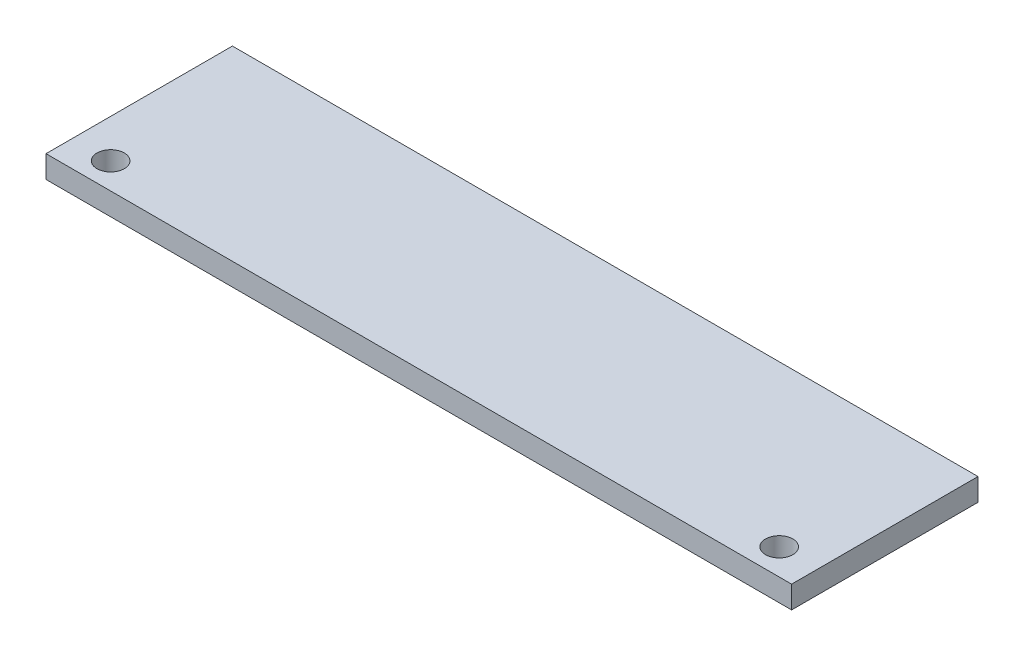
ISO-10303-21;
HEADER;
FILE_DESCRIPTION(('STEP AP214'),'2;1');
FILE_NAME('part.step','',(''),(''),'','','');
FILE_SCHEMA(('AUTOMOTIVE_DESIGN { 1 0 10303 214 1 1 1 1 }'));
ENDSEC;
DATA;
#1=APPLICATION_CONTEXT('core data for automotive mechanical design processes');
#2=APPLICATION_PROTOCOL_DEFINITION('international standard','automotive_design',2000,#1);
#3=PRODUCT_CONTEXT('',#1,'mechanical');
#4=PRODUCT('Part','Part','',(#3));
#5=PRODUCT_RELATED_PRODUCT_CATEGORY('part','',(#4));
#6=PRODUCT_DEFINITION_FORMATION('','',#4);
#7=PRODUCT_DEFINITION_CONTEXT('part definition',#1,'design');
#8=PRODUCT_DEFINITION('design','',#6,#7);
#9=PRODUCT_DEFINITION_SHAPE('','',#8);
#10=(LENGTH_UNIT() NAMED_UNIT(*) SI_UNIT(.MILLI.,.METRE.));
#11=(NAMED_UNIT(*) PLANE_ANGLE_UNIT() SI_UNIT($,.RADIAN.));
#12=(NAMED_UNIT(*) SI_UNIT($,.STERADIAN.) SOLID_ANGLE_UNIT());
#13=UNCERTAINTY_MEASURE_WITH_UNIT(LENGTH_MEASURE(1.E-05),#10,'distance_accuracy_value','');
#14=(GEOMETRIC_REPRESENTATION_CONTEXT(3) GLOBAL_UNCERTAINTY_ASSIGNED_CONTEXT((#13)) GLOBAL_UNIT_ASSIGNED_CONTEXT((#10,
#11,#12)) REPRESENTATION_CONTEXT('',''));
#15=CARTESIAN_POINT('',(0.,0.,0.));
#16=DIRECTION('',(0.,0.,1.));
#17=DIRECTION('',(1.,0.,0.));
#18=AXIS2_PLACEMENT_3D('',#15,#16,#17);
#19=CARTESIAN_POINT('',(300.,18.,-75.));
#20=DIRECTION('',(-1.,0.,0.));
#21=DIRECTION('',(0.,0.,1.));
#22=AXIS2_PLACEMENT_3D('',#19,#20,#21);
#23=PLANE('',#22);
#24=DIRECTION('',(0.,0.,-1.));
#25=VECTOR('',#24,1.);
#26=CARTESIAN_POINT('',(300.,0.,-75.));
#27=LINE('',#26,#25);
#28=CARTESIAN_POINT('',(300.,0.,75.));
#29=VERTEX_POINT('',#28);
#30=CARTESIAN_POINT('',(300.,0.,-75.));
#31=VERTEX_POINT('',#30);
#32=EDGE_CURVE('E105',#29,#31,#27,.T.);
#33=ORIENTED_EDGE('',*,*,#32,.T.);
#34=DIRECTION('',(0.,-1.,0.));
#35=VECTOR('',#34,1.);
#36=CARTESIAN_POINT('',(300.,18.,-75.));
#37=LINE('',#36,#35);
#38=CARTESIAN_POINT('',(300.,18.,-75.));
#39=VERTEX_POINT('',#38);
#40=EDGE_CURVE('E11',#39,#31,#37,.T.);
#41=ORIENTED_EDGE('',*,*,#40,.F.);
#42=DIRECTION('',(0.,0.,-1.));
#43=VECTOR('',#42,1.);
#44=CARTESIAN_POINT('',(300.,18.,-75.));
#45=LINE('',#44,#43);
#46=CARTESIAN_POINT('',(300.,18.,75.));
#47=VERTEX_POINT('',#46);
#48=EDGE_CURVE('E92',#47,#39,#45,.T.);
#49=ORIENTED_EDGE('',*,*,#48,.F.);
#50=DIRECTION('',(0.,-1.,0.));
#51=VECTOR('',#50,1.);
#52=CARTESIAN_POINT('',(300.,18.,75.));
#53=LINE('',#52,#51);
#54=EDGE_CURVE('E101',#47,#29,#53,.T.);
#55=ORIENTED_EDGE('',*,*,#54,.T.);
#56=EDGE_LOOP('',(#33,#41,#49,#55));
#57=FACE_BOUND('',#56,.T.);
#58=ADVANCED_FACE('F39',(#57),#23,.F.);
#59=CARTESIAN_POINT('',(-300.,18.,-75.));
#60=DIRECTION('',(0.,0.,1.));
#61=DIRECTION('',(1.,0.,0.));
#62=AXIS2_PLACEMENT_3D('',#59,#60,#61);
#63=PLANE('',#62);
#64=DIRECTION('',(-1.,0.,0.));
#65=VECTOR('',#64,1.);
#66=CARTESIAN_POINT('',(-300.,0.,-75.));
#67=LINE('',#66,#65);
#68=CARTESIAN_POINT('',(-300.,0.,-75.));
#69=VERTEX_POINT('',#68);
#70=EDGE_CURVE('E96',#31,#69,#67,.T.);
#71=ORIENTED_EDGE('',*,*,#70,.T.);
#72=DIRECTION('',(0.,-1.,0.));
#73=VECTOR('',#72,1.);
#74=CARTESIAN_POINT('',(-300.,18.,-75.));
#75=LINE('',#74,#73);
#76=CARTESIAN_POINT('',(-300.,18.,-75.));
#77=VERTEX_POINT('',#76);
#78=EDGE_CURVE('E48',#77,#69,#75,.T.);
#79=ORIENTED_EDGE('',*,*,#78,.F.);
#80=DIRECTION('',(-1.,0.,0.));
#81=VECTOR('',#80,1.);
#82=CARTESIAN_POINT('',(-300.,18.,-75.));
#83=LINE('',#82,#81);
#84=EDGE_CURVE('E87',#39,#77,#83,.T.);
#85=ORIENTED_EDGE('',*,*,#84,.F.);
#86=ORIENTED_EDGE('',*,*,#40,.T.);
#87=EDGE_LOOP('',(#71,#79,#85,#86));
#88=FACE_BOUND('',#87,.T.);
#89=ADVANCED_FACE('F95',(#88),#63,.F.);
#90=CARTESIAN_POINT('',(-300.,18.,-75.));
#91=DIRECTION('',(1.,0.,0.));
#92=DIRECTION('',(0.,0.,-1.));
#93=AXIS2_PLACEMENT_3D('',#90,#91,#92);
#94=PLANE('',#93);
#95=DIRECTION('',(0.,0.,1.));
#96=VECTOR('',#95,1.);
#97=CARTESIAN_POINT('',(-300.,0.,-75.));
#98=LINE('',#97,#96);
#99=CARTESIAN_POINT('',(-300.,0.,75.));
#100=VERTEX_POINT('',#99);
#101=EDGE_CURVE('E74',#69,#100,#98,.T.);
#102=ORIENTED_EDGE('',*,*,#101,.T.);
#103=DIRECTION('',(0.,-1.,0.));
#104=VECTOR('',#103,1.);
#105=CARTESIAN_POINT('',(-300.,18.,75.));
#106=LINE('',#105,#104);
#107=CARTESIAN_POINT('',(-300.,18.,75.));
#108=VERTEX_POINT('',#107);
#109=EDGE_CURVE('E97',#108,#100,#106,.T.);
#110=ORIENTED_EDGE('',*,*,#109,.F.);
#111=DIRECTION('',(0.,0.,1.));
#112=VECTOR('',#111,1.);
#113=CARTESIAN_POINT('',(-300.,18.,-75.));
#114=LINE('',#113,#112);
#115=EDGE_CURVE('E90',#77,#108,#114,.T.);
#116=ORIENTED_EDGE('',*,*,#115,.F.);
#117=ORIENTED_EDGE('',*,*,#78,.T.);
#118=EDGE_LOOP('',(#102,#110,#116,#117));
#119=FACE_BOUND('',#118,.T.);
#120=ADVANCED_FACE('F99',(#119),#94,.F.);
#121=CARTESIAN_POINT('',(-300.,18.,75.));
#122=DIRECTION('',(0.,0.,-1.));
#123=DIRECTION('',(-1.,0.,0.));
#124=AXIS2_PLACEMENT_3D('',#121,#122,#123);
#125=PLANE('',#124);
#126=DIRECTION('',(1.,0.,0.));
#127=VECTOR('',#126,1.);
#128=CARTESIAN_POINT('',(-300.,0.,75.));
#129=LINE('',#128,#127);
#130=EDGE_CURVE('E80',#100,#29,#129,.T.);
#131=ORIENTED_EDGE('',*,*,#130,.T.);
#132=ORIENTED_EDGE('',*,*,#54,.F.);
#133=DIRECTION('',(1.,0.,0.));
#134=VECTOR('',#133,1.);
#135=CARTESIAN_POINT('',(-300.,18.,75.));
#136=LINE('',#135,#134);
#137=EDGE_CURVE('E57',#108,#47,#136,.T.);
#138=ORIENTED_EDGE('',*,*,#137,.F.);
#139=ORIENTED_EDGE('',*,*,#109,.T.);
#140=EDGE_LOOP('',(#131,#132,#138,#139));
#141=FACE_BOUND('',#140,.T.);
#142=ADVANCED_FACE('F132',(#141),#125,.F.);
#143=CARTESIAN_POINT('',(0.,18.,0.));
#144=DIRECTION('',(0.,1.,0.));
#145=DIRECTION('',(0.,0.,1.));
#146=AXIS2_PLACEMENT_3D('',#143,#144,#145);
#147=PLANE('',#146);
#148=CARTESIAN_POINT('',(269.,18.,54.));
#149=DIRECTION('',(0.,1.,0.));
#150=DIRECTION('',(0.,0.,1.));
#151=AXIS2_PLACEMENT_3D('',#148,#149,#150);
#152=CIRCLE('',#151,11.);
#153=CARTESIAN_POINT('',(269.,18.,65.));
#154=VERTEX_POINT('',#153);
#155=EDGE_CURVE('E114',#154,#154,#152,.T.);
#156=ORIENTED_EDGE('',*,*,#155,.F.);
#157=EDGE_LOOP('',(#156));
#158=FACE_BOUND('',#157,.T.);
#159=CARTESIAN_POINT('',(-269.,18.,54.));
#160=DIRECTION('',(0.,1.,0.));
#161=DIRECTION('',(0.,0.,1.));
#162=AXIS2_PLACEMENT_3D('',#159,#160,#161);
#163=CIRCLE('',#162,11.);
#164=CARTESIAN_POINT('',(-269.,18.,65.));
#165=VERTEX_POINT('',#164);
#166=EDGE_CURVE('E119',#165,#165,#163,.T.);
#167=ORIENTED_EDGE('',*,*,#166,.F.);
#168=EDGE_LOOP('',(#167));
#169=FACE_BOUND('',#168,.T.);
#170=ORIENTED_EDGE('',*,*,#48,.T.);
#171=ORIENTED_EDGE('',*,*,#84,.T.);
#172=ORIENTED_EDGE('',*,*,#115,.T.);
#173=ORIENTED_EDGE('',*,*,#137,.T.);
#174=EDGE_LOOP('',(#170,#171,#172,#173));
#175=FACE_BOUND('',#174,.T.);
#176=ADVANCED_FACE('F88',(#158,#169,#175),#147,.T.);
#177=CARTESIAN_POINT('',(0.,0.,0.));
#178=DIRECTION('',(0.,1.,0.));
#179=DIRECTION('',(0.,0.,1.));
#180=AXIS2_PLACEMENT_3D('',#177,#178,#179);
#181=PLANE('',#180);
#182=CARTESIAN_POINT('',(269.,0.,54.));
#183=DIRECTION('',(0.,1.,0.));
#184=DIRECTION('',(0.,0.,1.));
#185=AXIS2_PLACEMENT_3D('',#182,#183,#184);
#186=CIRCLE('',#185,11.);
#187=CARTESIAN_POINT('',(269.,0.,65.));
#188=VERTEX_POINT('',#187);
#189=EDGE_CURVE('E42',#188,#188,#186,.T.);
#190=ORIENTED_EDGE('',*,*,#189,.T.);
#191=EDGE_LOOP('',(#190));
#192=FACE_BOUND('',#191,.T.);
#193=CARTESIAN_POINT('',(-269.,0.,54.));
#194=DIRECTION('',(0.,1.,0.));
#195=DIRECTION('',(0.,0.,1.));
#196=AXIS2_PLACEMENT_3D('',#193,#194,#195);
#197=CIRCLE('',#196,11.);
#198=CARTESIAN_POINT('',(-269.,0.,65.));
#199=VERTEX_POINT('',#198);
#200=EDGE_CURVE('E112',#199,#199,#197,.T.);
#201=ORIENTED_EDGE('',*,*,#200,.T.);
#202=EDGE_LOOP('',(#201));
#203=FACE_BOUND('',#202,.T.);
#204=ORIENTED_EDGE('',*,*,#32,.F.);
#205=ORIENTED_EDGE('',*,*,#130,.F.);
#206=ORIENTED_EDGE('',*,*,#101,.F.);
#207=ORIENTED_EDGE('',*,*,#70,.F.);
#208=EDGE_LOOP('',(#204,#205,#206,#207));
#209=FACE_BOUND('',#208,.T.);
#210=ADVANCED_FACE('F131',(#192,#203,#209),#181,.F.);
#211=CARTESIAN_POINT('',(-269.,-2.,54.));
#212=DIRECTION('',(0.,1.,0.));
#213=DIRECTION('',(0.,0.,1.));
#214=AXIS2_PLACEMENT_3D('',#211,#212,#213);
#215=CYLINDRICAL_SURFACE('',#214,11.);
#216=ORIENTED_EDGE('',*,*,#166,.T.);
#217=EDGE_LOOP('',(#216));
#218=FACE_BOUND('',#217,.T.);
#219=ORIENTED_EDGE('',*,*,#200,.F.);
#220=EDGE_LOOP('',(#219));
#221=FACE_BOUND('',#220,.T.);
#222=ADVANCED_FACE('F127',(#218,#221),#215,.F.);
#223=CARTESIAN_POINT('',(269.,-2.,54.));
#224=DIRECTION('',(0.,1.,0.));
#225=DIRECTION('',(0.,0.,1.));
#226=AXIS2_PLACEMENT_3D('',#223,#224,#225);
#227=CYLINDRICAL_SURFACE('',#226,11.);
#228=ORIENTED_EDGE('',*,*,#155,.T.);
#229=EDGE_LOOP('',(#228));
#230=FACE_BOUND('',#229,.T.);
#231=ORIENTED_EDGE('',*,*,#189,.F.);
#232=EDGE_LOOP('',(#231));
#233=FACE_BOUND('',#232,.T.);
#234=ADVANCED_FACE('F182',(#230,#233),#227,.F.);
#235=CLOSED_SHELL('',(#58,#89,#120,#142,#176,#210,#222,#234));
#236=MANIFOLD_SOLID_BREP('B2',#235);
#237=ADVANCED_BREP_SHAPE_REPRESENTATION('',(#18,#236),#14);
#238=SHAPE_DEFINITION_REPRESENTATION(#9,#237);
ENDSEC;
END-ISO-10303-21;
